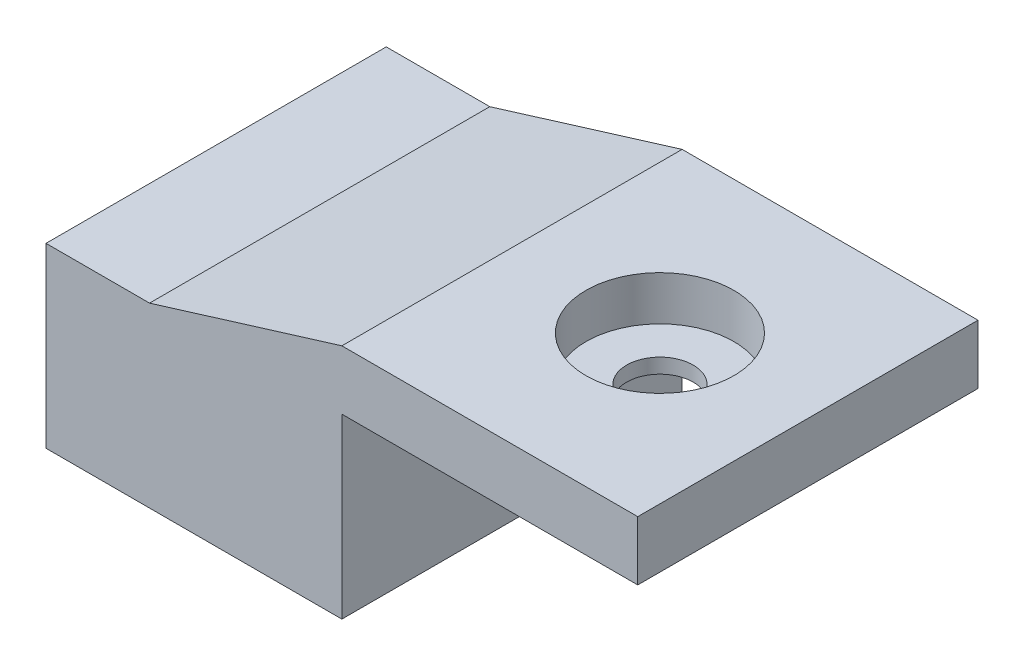
ISO-10303-21;
HEADER;
FILE_DESCRIPTION(('STEP AP214'),'2;1');
FILE_NAME('part.step','',(''),(''),'','','');
FILE_SCHEMA(('AUTOMOTIVE_DESIGN { 1 0 10303 214 1 1 1 1 }'));
ENDSEC;
DATA;
#1=APPLICATION_CONTEXT('core data for automotive mechanical design processes');
#2=APPLICATION_PROTOCOL_DEFINITION('international standard','automotive_design',2000,#1);
#3=PRODUCT_CONTEXT('',#1,'mechanical');
#4=PRODUCT('Part','Part','',(#3));
#5=PRODUCT_RELATED_PRODUCT_CATEGORY('part','',(#4));
#6=PRODUCT_DEFINITION_FORMATION('','',#4);
#7=PRODUCT_DEFINITION_CONTEXT('part definition',#1,'design');
#8=PRODUCT_DEFINITION('design','',#6,#7);
#9=PRODUCT_DEFINITION_SHAPE('','',#8);
#10=(LENGTH_UNIT() NAMED_UNIT(*) SI_UNIT(.MILLI.,.METRE.));
#11=(NAMED_UNIT(*) PLANE_ANGLE_UNIT() SI_UNIT($,.RADIAN.));
#12=(NAMED_UNIT(*) SI_UNIT($,.STERADIAN.) SOLID_ANGLE_UNIT());
#13=UNCERTAINTY_MEASURE_WITH_UNIT(LENGTH_MEASURE(1.E-05),#10,'distance_accuracy_value','');
#14=(GEOMETRIC_REPRESENTATION_CONTEXT(3) GLOBAL_UNCERTAINTY_ASSIGNED_CONTEXT((#13)) GLOBAL_UNIT_ASSIGNED_CONTEXT((#10,
#11,#12)) REPRESENTATION_CONTEXT('',''));
#15=CARTESIAN_POINT('',(0.,0.,0.));
#16=DIRECTION('',(0.,0.,1.));
#17=DIRECTION('',(1.,0.,0.));
#18=AXIS2_PLACEMENT_3D('',#15,#16,#17);
#19=CARTESIAN_POINT('',(0.,12.,23.));
#20=DIRECTION('',(1.,0.,0.));
#21=DIRECTION('',(0.,1.,0.));
#22=AXIS2_PLACEMENT_3D('',#19,#20,#21);
#23=PLANE('',#22);
#24=CARTESIAN_POINT('',(0.,5.5,5.));
#25=DIRECTION('',(-1.,0.,0.));
#26=DIRECTION('',(0.,0.,1.));
#27=AXIS2_PLACEMENT_3D('',#24,#25,#26);
#28=CIRCLE('',#27,2.8);
#29=CARTESIAN_POINT('',(0.,5.5,7.8));
#30=VERTEX_POINT('',#29);
#31=EDGE_CURVE('E194',#30,#30,#28,.T.);
#32=ORIENTED_EDGE('',*,*,#31,.F.);
#33=EDGE_LOOP('',(#32));
#34=FACE_BOUND('',#33,.T.);
#35=CARTESIAN_POINT('',(0.,5.5,18.));
#36=DIRECTION('',(-1.,0.,0.));
#37=DIRECTION('',(0.,0.,1.));
#38=AXIS2_PLACEMENT_3D('',#35,#36,#37);
#39=CIRCLE('',#38,2.8);
#40=CARTESIAN_POINT('',(0.,5.5,20.8));
#41=VERTEX_POINT('',#40);
#42=EDGE_CURVE('E188',#41,#41,#39,.T.);
#43=ORIENTED_EDGE('',*,*,#42,.F.);
#44=EDGE_LOOP('',(#43));
#45=FACE_BOUND('',#44,.T.);
#46=DIRECTION('',(0.,-1.,0.));
#47=VECTOR('',#46,1.);
#48=CARTESIAN_POINT('',(0.,12.,0.));
#49=LINE('',#48,#47);
#50=CARTESIAN_POINT('',(0.,12.,0.));
#51=VERTEX_POINT('',#50);
#52=CARTESIAN_POINT('',(0.,0.,0.));
#53=VERTEX_POINT('',#52);
#54=EDGE_CURVE('E137',#51,#53,#49,.T.);
#55=ORIENTED_EDGE('',*,*,#54,.T.);
#56=DIRECTION('',(0.,0.,-1.));
#57=VECTOR('',#56,1.);
#58=CARTESIAN_POINT('',(0.,0.,23.));
#59=LINE('',#58,#57);
#60=CARTESIAN_POINT('',(0.,0.,23.));
#61=VERTEX_POINT('',#60);
#62=EDGE_CURVE('E11',#61,#53,#59,.T.);
#63=ORIENTED_EDGE('',*,*,#62,.F.);
#64=DIRECTION('',(0.,-1.,0.));
#65=VECTOR('',#64,1.);
#66=CARTESIAN_POINT('',(0.,12.,23.));
#67=LINE('',#66,#65);
#68=CARTESIAN_POINT('',(0.,12.,23.));
#69=VERTEX_POINT('',#68);
#70=EDGE_CURVE('E152',#69,#61,#67,.T.);
#71=ORIENTED_EDGE('',*,*,#70,.F.);
#72=DIRECTION('',(0.,0.,-1.));
#73=VECTOR('',#72,1.);
#74=CARTESIAN_POINT('',(0.,12.,23.));
#75=LINE('',#74,#73);
#76=EDGE_CURVE('E133',#69,#51,#75,.T.);
#77=ORIENTED_EDGE('',*,*,#76,.T.);
#78=EDGE_LOOP('',(#55,#63,#71,#77));
#79=FACE_BOUND('',#78,.T.);
#80=ADVANCED_FACE('F37',(#34,#45,#79),#23,.F.);
#81=CARTESIAN_POINT('',(0.,0.,23.));
#82=DIRECTION('',(0.,1.,0.));
#83=DIRECTION('',(0.,0.,1.));
#84=AXIS2_PLACEMENT_3D('',#81,#82,#83);
#85=PLANE('',#84);
#86=DIRECTION('',(1.,0.,0.));
#87=VECTOR('',#86,1.);
#88=CARTESIAN_POINT('',(0.,0.,0.));
#89=LINE('',#88,#87);
#90=CARTESIAN_POINT('',(20.,0.,0.));
#91=VERTEX_POINT('',#90);
#92=EDGE_CURVE('E140',#53,#91,#89,.T.);
#93=ORIENTED_EDGE('',*,*,#92,.T.);
#94=DIRECTION('',(0.,0.,-1.));
#95=VECTOR('',#94,1.);
#96=CARTESIAN_POINT('',(20.,0.,23.));
#97=LINE('',#96,#95);
#98=CARTESIAN_POINT('',(20.,0.,23.));
#99=VERTEX_POINT('',#98);
#100=EDGE_CURVE('E46',#99,#91,#97,.T.);
#101=ORIENTED_EDGE('',*,*,#100,.F.);
#102=DIRECTION('',(1.,0.,0.));
#103=VECTOR('',#102,1.);
#104=CARTESIAN_POINT('',(0.,0.,23.));
#105=LINE('',#104,#103);
#106=EDGE_CURVE('E98',#61,#99,#105,.T.);
#107=ORIENTED_EDGE('',*,*,#106,.F.);
#108=ORIENTED_EDGE('',*,*,#62,.T.);
#109=EDGE_LOOP('',(#93,#101,#107,#108));
#110=FACE_BOUND('',#109,.T.);
#111=ADVANCED_FACE('F219',(#110),#85,.F.);
#112=CARTESIAN_POINT('',(20.,0.,23.));
#113=DIRECTION('',(-1.,0.,0.));
#114=DIRECTION('',(0.,0.,1.));
#115=AXIS2_PLACEMENT_3D('',#112,#113,#114);
#116=PLANE('',#115);
#117=DIRECTION('',(0.,1.,0.));
#118=VECTOR('',#117,1.);
#119=CARTESIAN_POINT('',(20.,0.,0.));
#120=LINE('',#119,#118);
#121=CARTESIAN_POINT('',(20.,12.,0.));
#122=VERTEX_POINT('',#121);
#123=EDGE_CURVE('E143',#91,#122,#120,.T.);
#124=ORIENTED_EDGE('',*,*,#123,.T.);
#125=DIRECTION('',(0.,0.,-1.));
#126=VECTOR('',#125,1.);
#127=CARTESIAN_POINT('',(20.,12.,23.));
#128=LINE('',#127,#126);
#129=CARTESIAN_POINT('',(20.,12.,23.));
#130=VERTEX_POINT('',#129);
#131=EDGE_CURVE('E159',#130,#122,#128,.T.);
#132=ORIENTED_EDGE('',*,*,#131,.F.);
#133=DIRECTION('',(0.,1.,0.));
#134=VECTOR('',#133,1.);
#135=CARTESIAN_POINT('',(20.,0.,23.));
#136=LINE('',#135,#134);
#137=EDGE_CURVE('E168',#99,#130,#136,.T.);
#138=ORIENTED_EDGE('',*,*,#137,.F.);
#139=ORIENTED_EDGE('',*,*,#100,.T.);
#140=EDGE_LOOP('',(#124,#132,#138,#139));
#141=FACE_BOUND('',#140,.T.);
#142=ADVANCED_FACE('F166',(#141),#116,.F.);
#143=CARTESIAN_POINT('',(20.,12.,23.));
#144=DIRECTION('',(0.,1.,0.));
#145=DIRECTION('',(0.,0.,1.));
#146=AXIS2_PLACEMENT_3D('',#143,#144,#145);
#147=PLANE('',#146);
#148=CARTESIAN_POINT('',(30.,12.,11.5));
#149=DIRECTION('',(0.,1.,0.));
#150=DIRECTION('',(0.,0.,1.));
#151=AXIS2_PLACEMENT_3D('',#148,#149,#150);
#152=CIRCLE('',#151,2.25);
#153=CARTESIAN_POINT('',(30.,12.,13.75));
#154=VERTEX_POINT('',#153);
#155=EDGE_CURVE('E40',#154,#154,#152,.T.);
#156=ORIENTED_EDGE('',*,*,#155,.T.);
#157=EDGE_LOOP('',(#156));
#158=FACE_BOUND('',#157,.T.);
#159=DIRECTION('',(1.,0.,0.));
#160=VECTOR('',#159,1.);
#161=CARTESIAN_POINT('',(20.,12.,0.));
#162=LINE('',#161,#160);
#163=CARTESIAN_POINT('',(40.,12.,0.));
#164=VERTEX_POINT('',#163);
#165=EDGE_CURVE('E145',#122,#164,#162,.T.);
#166=ORIENTED_EDGE('',*,*,#165,.T.);
#167=DIRECTION('',(0.,0.,-1.));
#168=VECTOR('',#167,1.);
#169=CARTESIAN_POINT('',(40.,12.,23.));
#170=LINE('',#169,#168);
#171=CARTESIAN_POINT('',(40.,12.,23.));
#172=VERTEX_POINT('',#171);
#173=EDGE_CURVE('E156',#172,#164,#170,.T.);
#174=ORIENTED_EDGE('',*,*,#173,.F.);
#175=DIRECTION('',(1.,0.,0.));
#176=VECTOR('',#175,1.);
#177=CARTESIAN_POINT('',(20.,12.,23.));
#178=LINE('',#177,#176);
#179=EDGE_CURVE('E180',#130,#172,#178,.T.);
#180=ORIENTED_EDGE('',*,*,#179,.F.);
#181=ORIENTED_EDGE('',*,*,#131,.T.);
#182=EDGE_LOOP('',(#166,#174,#180,#181));
#183=FACE_BOUND('',#182,.T.);
#184=ADVANCED_FACE('F176',(#158,#183),#147,.F.);
#185=CARTESIAN_POINT('',(40.,12.,23.));
#186=DIRECTION('',(-1.,0.,0.));
#187=DIRECTION('',(0.,0.,1.));
#188=AXIS2_PLACEMENT_3D('',#185,#186,#187);
#189=PLANE('',#188);
#190=DIRECTION('',(0.,1.,0.));
#191=VECTOR('',#190,1.);
#192=CARTESIAN_POINT('',(40.,12.,0.));
#193=LINE('',#192,#191);
#194=CARTESIAN_POINT('',(40.,16.,0.));
#195=VERTEX_POINT('',#194);
#196=EDGE_CURVE('E147',#164,#195,#193,.T.);
#197=ORIENTED_EDGE('',*,*,#196,.T.);
#198=DIRECTION('',(0.,0.,-1.));
#199=VECTOR('',#198,1.);
#200=CARTESIAN_POINT('',(40.,16.,23.));
#201=LINE('',#200,#199);
#202=CARTESIAN_POINT('',(40.,16.,23.));
#203=VERTEX_POINT('',#202);
#204=EDGE_CURVE('E128',#203,#195,#201,.T.);
#205=ORIENTED_EDGE('',*,*,#204,.F.);
#206=DIRECTION('',(0.,1.,0.));
#207=VECTOR('',#206,1.);
#208=CARTESIAN_POINT('',(40.,12.,23.));
#209=LINE('',#208,#207);
#210=EDGE_CURVE('E119',#172,#203,#209,.T.);
#211=ORIENTED_EDGE('',*,*,#210,.F.);
#212=ORIENTED_EDGE('',*,*,#173,.T.);
#213=EDGE_LOOP('',(#197,#205,#211,#212));
#214=FACE_BOUND('',#213,.T.);
#215=ADVANCED_FACE('F179',(#214),#189,.F.);
#216=CARTESIAN_POINT('',(40.,16.,23.));
#217=DIRECTION('',(0.,-1.,0.));
#218=DIRECTION('',(1.,0.,0.));
#219=AXIS2_PLACEMENT_3D('',#216,#217,#218);
#220=PLANE('',#219);
#221=CARTESIAN_POINT('',(30.,16.,11.5));
#222=DIRECTION('',(0.,1.,0.));
#223=DIRECTION('',(0.,0.,1.));
#224=AXIS2_PLACEMENT_3D('',#221,#222,#223);
#225=CIRCLE('',#224,5.);
#226=CARTESIAN_POINT('',(30.,16.,16.5));
#227=VERTEX_POINT('',#226);
#228=EDGE_CURVE('E203',#227,#227,#225,.T.);
#229=ORIENTED_EDGE('',*,*,#228,.F.);
#230=EDGE_LOOP('',(#229));
#231=FACE_BOUND('',#230,.T.);
#232=DIRECTION('',(-1.,0.,0.));
#233=VECTOR('',#232,1.);
#234=CARTESIAN_POINT('',(40.,16.,0.));
#235=LINE('',#234,#233);
#236=CARTESIAN_POINT('',(20.,16.,0.));
#237=VERTEX_POINT('',#236);
#238=EDGE_CURVE('E127',#195,#237,#235,.T.);
#239=ORIENTED_EDGE('',*,*,#238,.T.);
#240=DIRECTION('',(0.,0.,-1.));
#241=VECTOR('',#240,1.);
#242=CARTESIAN_POINT('',(20.,16.,23.));
#243=LINE('',#242,#241);
#244=CARTESIAN_POINT('',(20.,16.,23.));
#245=VERTEX_POINT('',#244);
#246=EDGE_CURVE('E124',#245,#237,#243,.T.);
#247=ORIENTED_EDGE('',*,*,#246,.F.);
#248=DIRECTION('',(-1.,0.,0.));
#249=VECTOR('',#248,1.);
#250=CARTESIAN_POINT('',(40.,16.,23.));
#251=LINE('',#250,#249);
#252=EDGE_CURVE('E113',#203,#245,#251,.T.);
#253=ORIENTED_EDGE('',*,*,#252,.F.);
#254=ORIENTED_EDGE('',*,*,#204,.T.);
#255=EDGE_LOOP('',(#239,#247,#253,#254));
#256=FACE_BOUND('',#255,.T.);
#257=ADVANCED_FACE('F125',(#231,#256),#220,.F.);
#258=CARTESIAN_POINT('',(7.,12.,23.));
#259=DIRECTION('',(0.294085848837523,-0.95577900872195,0.));
#260=DIRECTION('',(0.95577900872195,0.294085848837523,0.));
#261=AXIS2_PLACEMENT_3D('',#258,#259,#260);
#262=PLANE('',#261);
#263=DIRECTION('',(-0.95577900872195,-0.294085848837523,0.));
#264=VECTOR('',#263,1.);
#265=CARTESIAN_POINT('',(7.,12.,0.));
#266=LINE('',#265,#264);
#267=CARTESIAN_POINT('',(7.,12.,0.));
#268=VERTEX_POINT('',#267);
#269=EDGE_CURVE('E84',#237,#268,#266,.T.);
#270=ORIENTED_EDGE('',*,*,#269,.T.);
#271=DIRECTION('',(0.,0.,-1.));
#272=VECTOR('',#271,1.);
#273=CARTESIAN_POINT('',(7.,12.,23.));
#274=LINE('',#273,#272);
#275=CARTESIAN_POINT('',(7.,12.,23.));
#276=VERTEX_POINT('',#275);
#277=EDGE_CURVE('E129',#276,#268,#274,.T.);
#278=ORIENTED_EDGE('',*,*,#277,.F.);
#279=DIRECTION('',(-0.95577900872195,-0.294085848837523,0.));
#280=VECTOR('',#279,1.);
#281=CARTESIAN_POINT('',(7.,12.,23.));
#282=LINE('',#281,#280);
#283=EDGE_CURVE('E117',#245,#276,#282,.T.);
#284=ORIENTED_EDGE('',*,*,#283,.F.);
#285=ORIENTED_EDGE('',*,*,#246,.T.);
#286=EDGE_LOOP('',(#270,#278,#284,#285));
#287=FACE_BOUND('',#286,.T.);
#288=ADVANCED_FACE('F131',(#287),#262,.F.);
#289=CARTESIAN_POINT('',(0.,12.,23.));
#290=DIRECTION('',(0.,-1.,0.));
#291=DIRECTION('',(0.,0.,-1.));
#292=AXIS2_PLACEMENT_3D('',#289,#290,#291);
#293=PLANE('',#292);
#294=DIRECTION('',(-1.,0.,0.));
#295=VECTOR('',#294,1.);
#296=CARTESIAN_POINT('',(0.,12.,0.));
#297=LINE('',#296,#295);
#298=EDGE_CURVE('E90',#268,#51,#297,.T.);
#299=ORIENTED_EDGE('',*,*,#298,.T.);
#300=ORIENTED_EDGE('',*,*,#76,.F.);
#301=DIRECTION('',(-1.,0.,0.));
#302=VECTOR('',#301,1.);
#303=CARTESIAN_POINT('',(0.,12.,23.));
#304=LINE('',#303,#302);
#305=EDGE_CURVE('E54',#276,#69,#304,.T.);
#306=ORIENTED_EDGE('',*,*,#305,.F.);
#307=ORIENTED_EDGE('',*,*,#277,.T.);
#308=EDGE_LOOP('',(#299,#300,#306,#307));
#309=FACE_BOUND('',#308,.T.);
#310=ADVANCED_FACE('F215',(#309),#293,.F.);
#311=CARTESIAN_POINT('',(0.,0.,23.));
#312=DIRECTION('',(0.,0.,1.));
#313=DIRECTION('',(1.,0.,0.));
#314=AXIS2_PLACEMENT_3D('',#311,#312,#313);
#315=PLANE('',#314);
#316=ORIENTED_EDGE('',*,*,#70,.T.);
#317=ORIENTED_EDGE('',*,*,#106,.T.);
#318=ORIENTED_EDGE('',*,*,#137,.T.);
#319=ORIENTED_EDGE('',*,*,#179,.T.);
#320=ORIENTED_EDGE('',*,*,#210,.T.);
#321=ORIENTED_EDGE('',*,*,#252,.T.);
#322=ORIENTED_EDGE('',*,*,#283,.T.);
#323=ORIENTED_EDGE('',*,*,#305,.T.);
#324=EDGE_LOOP('',(#316,#317,#318,#319,#320,#321,#322,#323));
#325=FACE_BOUND('',#324,.T.);
#326=ADVANCED_FACE('F115',(#325),#315,.T.);
#327=CARTESIAN_POINT('',(0.,0.,0.));
#328=DIRECTION('',(0.,0.,1.));
#329=DIRECTION('',(1.,0.,0.));
#330=AXIS2_PLACEMENT_3D('',#327,#328,#329);
#331=PLANE('',#330);
#332=ORIENTED_EDGE('',*,*,#54,.F.);
#333=ORIENTED_EDGE('',*,*,#298,.F.);
#334=ORIENTED_EDGE('',*,*,#269,.F.);
#335=ORIENTED_EDGE('',*,*,#238,.F.);
#336=ORIENTED_EDGE('',*,*,#196,.F.);
#337=ORIENTED_EDGE('',*,*,#165,.F.);
#338=ORIENTED_EDGE('',*,*,#123,.F.);
#339=ORIENTED_EDGE('',*,*,#92,.F.);
#340=EDGE_LOOP('',(#332,#333,#334,#335,#336,#337,#338,#339));
#341=FACE_BOUND('',#340,.T.);
#342=ADVANCED_FACE('F172',(#341),#331,.F.);
#343=CARTESIAN_POINT('',(10.,5.5,18.));
#344=DIRECTION('',(-1.,0.,0.));
#345=DIRECTION('',(0.,0.,1.));
#346=AXIS2_PLACEMENT_3D('',#343,#344,#345);
#347=CONICAL_SURFACE('',#346,2.8,1.02974425867665);
#348=CARTESIAN_POINT('',(11.6824097332772,5.5,18.));
#349=VERTEX_POINT('',#348);
#350=VERTEX_LOOP('',#349);
#351=FACE_BOUND('',#350,.T.);
#352=CARTESIAN_POINT('',(10.,5.5,18.));
#353=DIRECTION('',(-1.,0.,0.));
#354=DIRECTION('',(0.,0.,1.));
#355=AXIS2_PLACEMENT_3D('',#352,#353,#354);
#356=CIRCLE('',#355,2.8);
#357=CARTESIAN_POINT('',(10.,5.5,20.8));
#358=VERTEX_POINT('',#357);
#359=EDGE_CURVE('E141',#358,#358,#356,.T.);
#360=ORIENTED_EDGE('',*,*,#359,.T.);
#361=EDGE_LOOP('',(#360));
#362=FACE_BOUND('',#361,.T.);
#363=ADVANCED_FACE('F238',(#351,#362),#347,.F.);
#364=CARTESIAN_POINT('',(0.,5.5,18.));
#365=DIRECTION('',(-1.,0.,0.));
#366=DIRECTION('',(0.,0.,1.));
#367=AXIS2_PLACEMENT_3D('',#364,#365,#366);
#368=CYLINDRICAL_SURFACE('',#367,2.8);
#369=ORIENTED_EDGE('',*,*,#359,.F.);
#370=EDGE_LOOP('',(#369));
#371=FACE_BOUND('',#370,.T.);
#372=ORIENTED_EDGE('',*,*,#42,.T.);
#373=EDGE_LOOP('',(#372));
#374=FACE_BOUND('',#373,.T.);
#375=ADVANCED_FACE('F242',(#371,#374),#368,.F.);
#376=CARTESIAN_POINT('',(10.,5.5,5.));
#377=DIRECTION('',(-1.,0.,0.));
#378=DIRECTION('',(0.,0.,1.));
#379=AXIS2_PLACEMENT_3D('',#376,#377,#378);
#380=CONICAL_SURFACE('',#379,2.8,1.02974425867665);
#381=CARTESIAN_POINT('',(11.6824097332772,5.5,5.));
#382=VERTEX_POINT('',#381);
#383=VERTEX_LOOP('',#382);
#384=FACE_BOUND('',#383,.T.);
#385=CARTESIAN_POINT('',(10.,5.5,5.));
#386=DIRECTION('',(-1.,0.,0.));
#387=DIRECTION('',(0.,0.,1.));
#388=AXIS2_PLACEMENT_3D('',#385,#386,#387);
#389=CIRCLE('',#388,2.8);
#390=CARTESIAN_POINT('',(10.,5.5,7.8));
#391=VERTEX_POINT('',#390);
#392=EDGE_CURVE('E191',#391,#391,#389,.T.);
#393=ORIENTED_EDGE('',*,*,#392,.T.);
#394=EDGE_LOOP('',(#393));
#395=FACE_BOUND('',#394,.T.);
#396=ADVANCED_FACE('F246',(#384,#395),#380,.F.);
#397=CARTESIAN_POINT('',(0.,5.5,5.));
#398=DIRECTION('',(-1.,0.,0.));
#399=DIRECTION('',(0.,0.,1.));
#400=AXIS2_PLACEMENT_3D('',#397,#398,#399);
#401=CYLINDRICAL_SURFACE('',#400,2.8);
#402=ORIENTED_EDGE('',*,*,#392,.F.);
#403=EDGE_LOOP('',(#402));
#404=FACE_BOUND('',#403,.T.);
#405=ORIENTED_EDGE('',*,*,#31,.T.);
#406=EDGE_LOOP('',(#405));
#407=FACE_BOUND('',#406,.T.);
#408=ADVANCED_FACE('F250',(#404,#407),#401,.F.);
#409=CARTESIAN_POINT('',(30.,16.,11.5));
#410=DIRECTION('',(0.,1.,0.));
#411=DIRECTION('',(0.,0.,1.));
#412=AXIS2_PLACEMENT_3D('',#409,#410,#411);
#413=CYLINDRICAL_SURFACE('',#412,2.25);
#414=CARTESIAN_POINT('',(30.,13.,11.5));
#415=DIRECTION('',(0.,1.,0.));
#416=DIRECTION('',(0.,0.,1.));
#417=AXIS2_PLACEMENT_3D('',#414,#415,#416);
#418=CIRCLE('',#417,2.25);
#419=CARTESIAN_POINT('',(30.,13.,13.75));
#420=VERTEX_POINT('',#419);
#421=EDGE_CURVE('E197',#420,#420,#418,.T.);
#422=ORIENTED_EDGE('',*,*,#421,.T.);
#423=EDGE_LOOP('',(#422));
#424=FACE_BOUND('',#423,.T.);
#425=ORIENTED_EDGE('',*,*,#155,.F.);
#426=EDGE_LOOP('',(#425));
#427=FACE_BOUND('',#426,.T.);
#428=ADVANCED_FACE('F254',(#424,#427),#413,.F.);
#429=CARTESIAN_POINT('',(32.25,13.,11.5));
#430=DIRECTION('',(0.,-1.,0.));
#431=DIRECTION('',(0.,0.,-1.));
#432=AXIS2_PLACEMENT_3D('',#429,#430,#431);
#433=PLANE('',#432);
#434=ORIENTED_EDGE('',*,*,#421,.F.);
#435=EDGE_LOOP('',(#434));
#436=FACE_BOUND('',#435,.T.);
#437=CARTESIAN_POINT('',(30.,13.,11.5));
#438=DIRECTION('',(0.,1.,0.));
#439=DIRECTION('',(0.,0.,1.));
#440=AXIS2_PLACEMENT_3D('',#437,#438,#439);
#441=CIRCLE('',#440,5.);
#442=CARTESIAN_POINT('',(30.,13.,16.5));
#443=VERTEX_POINT('',#442);
#444=EDGE_CURVE('E200',#443,#443,#441,.T.);
#445=ORIENTED_EDGE('',*,*,#444,.T.);
#446=EDGE_LOOP('',(#445));
#447=FACE_BOUND('',#446,.T.);
#448=ADVANCED_FACE('F258',(#436,#447),#433,.F.);
#449=CARTESIAN_POINT('',(30.,16.,11.5));
#450=DIRECTION('',(0.,1.,0.));
#451=DIRECTION('',(0.,0.,1.));
#452=AXIS2_PLACEMENT_3D('',#449,#450,#451);
#453=CYLINDRICAL_SURFACE('',#452,5.);
#454=ORIENTED_EDGE('',*,*,#444,.F.);
#455=EDGE_LOOP('',(#454));
#456=FACE_BOUND('',#455,.T.);
#457=ORIENTED_EDGE('',*,*,#228,.T.);
#458=EDGE_LOOP('',(#457));
#459=FACE_BOUND('',#458,.T.);
#460=ADVANCED_FACE('F207',(#456,#459),#453,.F.);
#461=CLOSED_SHELL('',(#80,#111,#142,#184,#215,#257,#288,#310,#326,#342,#363,#375,#396,#408,#428,
#448,#460));
#462=MANIFOLD_SOLID_BREP('B2',#461);
#463=ADVANCED_BREP_SHAPE_REPRESENTATION('',(#18,#462),#14);
#464=SHAPE_DEFINITION_REPRESENTATION(#9,#463);
ENDSEC;
END-ISO-10303-21;
